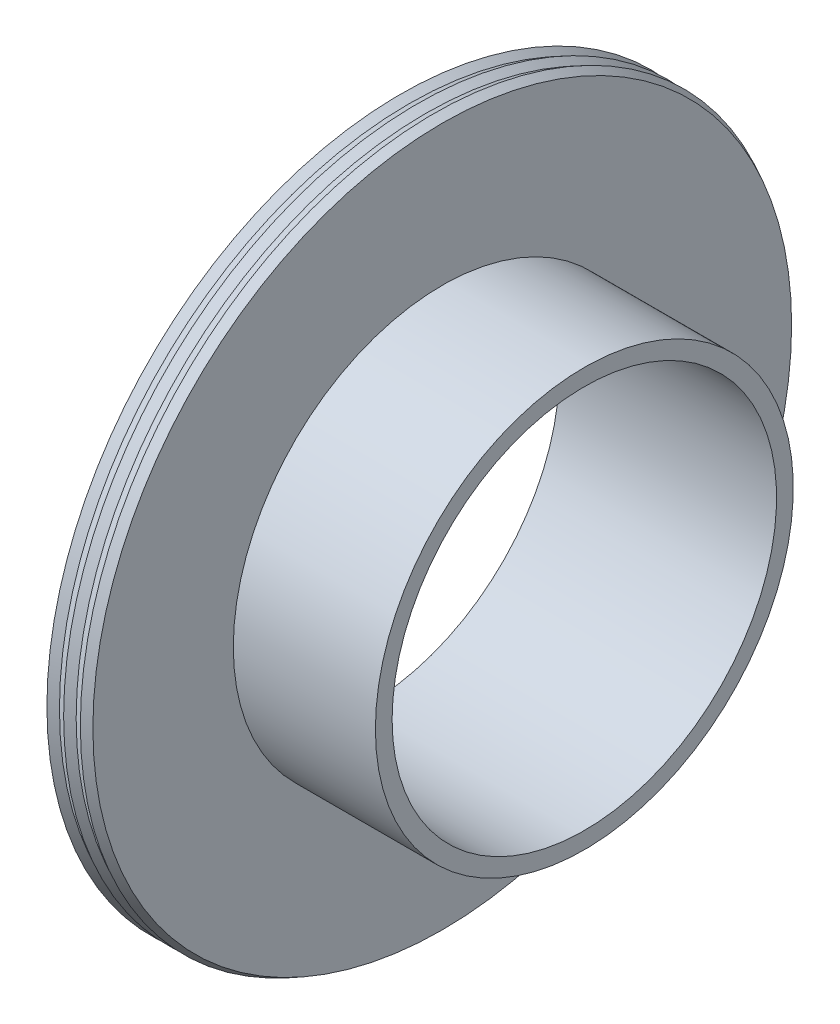
ISO-10303-21;
HEADER;
FILE_DESCRIPTION(('STEP AP214'),'2;1');
FILE_NAME('part.step','',(''),(''),'','','');
FILE_SCHEMA(('AUTOMOTIVE_DESIGN { 1 0 10303 214 1 1 1 1 }'));
ENDSEC;
DATA;
#1=APPLICATION_CONTEXT('core data for automotive mechanical design processes');
#2=APPLICATION_PROTOCOL_DEFINITION('international standard','automotive_design',2000,#1);
#3=PRODUCT_CONTEXT('',#1,'mechanical');
#4=PRODUCT('Part','Part','',(#3));
#5=PRODUCT_RELATED_PRODUCT_CATEGORY('part','',(#4));
#6=PRODUCT_DEFINITION_FORMATION('','',#4);
#7=PRODUCT_DEFINITION_CONTEXT('part definition',#1,'design');
#8=PRODUCT_DEFINITION('design','',#6,#7);
#9=PRODUCT_DEFINITION_SHAPE('','',#8);
#10=(LENGTH_UNIT() NAMED_UNIT(*) SI_UNIT(.MILLI.,.METRE.));
#11=(NAMED_UNIT(*) PLANE_ANGLE_UNIT() SI_UNIT($,.RADIAN.));
#12=(NAMED_UNIT(*) SI_UNIT($,.STERADIAN.) SOLID_ANGLE_UNIT());
#13=UNCERTAINTY_MEASURE_WITH_UNIT(LENGTH_MEASURE(1.E-05),#10,'distance_accuracy_value','');
#14=(GEOMETRIC_REPRESENTATION_CONTEXT(3) GLOBAL_UNCERTAINTY_ASSIGNED_CONTEXT((#13)) GLOBAL_UNIT_ASSIGNED_CONTEXT((#10,
#11,#12)) REPRESENTATION_CONTEXT('',''));
#15=CARTESIAN_POINT('',(0.,0.,0.));
#16=DIRECTION('',(0.,0.,1.));
#17=DIRECTION('',(1.,0.,0.));
#18=AXIS2_PLACEMENT_3D('',#15,#16,#17);
#19=CARTESIAN_POINT('',(6.00000000000001,0.,0.));
#20=DIRECTION('',(-1.,0.,0.));
#21=DIRECTION('',(0.,0.,1.));
#22=AXIS2_PLACEMENT_3D('',#19,#20,#21);
#23=CONICAL_SURFACE('',#22,42.3,0.463647609000817);
#24=CARTESIAN_POINT('',(7.,0.,0.));
#25=DIRECTION('',(-1.,0.,0.));
#26=DIRECTION('',(0.,0.,1.));
#27=AXIS2_PLACEMENT_3D('',#24,#25,#26);
#28=CIRCLE('',#27,41.8);
#29=CARTESIAN_POINT('',(7.,0.,41.8));
#30=VERTEX_POINT('',#29);
#31=EDGE_CURVE('E47',#30,#30,#28,.T.);
#32=ORIENTED_EDGE('',*,*,#31,.T.);
#33=EDGE_LOOP('',(#32));
#34=FACE_BOUND('',#33,.T.);
#35=CARTESIAN_POINT('',(6.00000000000001,0.,0.));
#36=DIRECTION('',(-1.,0.,0.));
#37=DIRECTION('',(0.,0.,1.));
#38=AXIS2_PLACEMENT_3D('',#35,#36,#37);
#39=CIRCLE('',#38,42.3);
#40=CARTESIAN_POINT('',(6.00000000000001,0.,42.3));
#41=VERTEX_POINT('',#40);
#42=EDGE_CURVE('E53',#41,#41,#39,.T.);
#43=ORIENTED_EDGE('',*,*,#42,.F.);
#44=EDGE_LOOP('',(#43));
#45=FACE_BOUND('',#44,.T.);
#46=ADVANCED_FACE('F41',(#34,#45),#23,.T.);
#47=CARTESIAN_POINT('',(7.,0.,0.));
#48=DIRECTION('',(1.,0.,0.));
#49=DIRECTION('',(0.,0.,-1.));
#50=AXIS2_PLACEMENT_3D('',#47,#48,#49);
#51=CONICAL_SURFACE('',#50,41.8,0.463647609000806);
#52=CARTESIAN_POINT('',(8.00000000000001,0.,0.));
#53=DIRECTION('',(-1.,0.,0.));
#54=DIRECTION('',(0.,0.,1.));
#55=AXIS2_PLACEMENT_3D('',#52,#53,#54);
#56=CIRCLE('',#55,42.3);
#57=CARTESIAN_POINT('',(8.00000000000001,0.,42.3));
#58=VERTEX_POINT('',#57);
#59=EDGE_CURVE('E10',#58,#58,#56,.T.);
#60=ORIENTED_EDGE('',*,*,#59,.T.);
#61=EDGE_LOOP('',(#60));
#62=FACE_BOUND('',#61,.T.);
#63=ORIENTED_EDGE('',*,*,#31,.F.);
#64=EDGE_LOOP('',(#63));
#65=FACE_BOUND('',#64,.T.);
#66=ADVANCED_FACE('F94',(#62,#65),#51,.T.);
#67=CARTESIAN_POINT('',(8.00000000000001,0.,0.));
#68=DIRECTION('',(-1.,0.,0.));
#69=DIRECTION('',(0.,0.,1.));
#70=AXIS2_PLACEMENT_3D('',#67,#68,#69);
#71=CONICAL_SURFACE('',#70,42.3,0.463647609000812);
#72=CARTESIAN_POINT('',(9.,0.,0.));
#73=DIRECTION('',(-1.,0.,0.));
#74=DIRECTION('',(0.,0.,1.));
#75=AXIS2_PLACEMENT_3D('',#72,#73,#74);
#76=CIRCLE('',#75,41.8);
#77=CARTESIAN_POINT('',(9.,0.,41.8));
#78=VERTEX_POINT('',#77);
#79=EDGE_CURVE('E66',#78,#78,#76,.T.);
#80=ORIENTED_EDGE('',*,*,#79,.T.);
#81=EDGE_LOOP('',(#80));
#82=FACE_BOUND('',#81,.T.);
#83=ORIENTED_EDGE('',*,*,#59,.F.);
#84=EDGE_LOOP('',(#83));
#85=FACE_BOUND('',#84,.T.);
#86=ADVANCED_FACE('F99',(#82,#85),#71,.T.);
#87=CARTESIAN_POINT('',(9.,0.,0.));
#88=DIRECTION('',(1.,0.,0.));
#89=DIRECTION('',(0.,0.,-1.));
#90=AXIS2_PLACEMENT_3D('',#87,#88,#89);
#91=PLANE('',#90);
#92=CARTESIAN_POINT('',(9.,0.,0.));
#93=DIRECTION('',(-1.,0.,0.));
#94=DIRECTION('',(0.,0.,1.));
#95=AXIS2_PLACEMENT_3D('',#92,#93,#94);
#96=CIRCLE('',#95,25.);
#97=CARTESIAN_POINT('',(9.,0.,25.));
#98=VERTEX_POINT('',#97);
#99=EDGE_CURVE('E75',#98,#98,#96,.T.);
#100=ORIENTED_EDGE('',*,*,#99,.T.);
#101=EDGE_LOOP('',(#100));
#102=FACE_BOUND('',#101,.T.);
#103=ORIENTED_EDGE('',*,*,#79,.F.);
#104=EDGE_LOOP('',(#103));
#105=FACE_BOUND('',#104,.T.);
#106=ADVANCED_FACE('F110',(#102,#105),#91,.T.);
#107=CARTESIAN_POINT('',(5.,0.,0.));
#108=DIRECTION('',(1.,0.,0.));
#109=DIRECTION('',(0.,0.,-1.));
#110=AXIS2_PLACEMENT_3D('',#107,#108,#109);
#111=CONICAL_SURFACE('',#110,41.8,0.463647609000806);
#112=ORIENTED_EDGE('',*,*,#42,.T.);
#113=EDGE_LOOP('',(#112));
#114=FACE_BOUND('',#113,.T.);
#115=CARTESIAN_POINT('',(5.,0.,0.));
#116=DIRECTION('',(-1.,0.,0.));
#117=DIRECTION('',(0.,0.,1.));
#118=AXIS2_PLACEMENT_3D('',#115,#116,#117);
#119=CIRCLE('',#118,41.8);
#120=CARTESIAN_POINT('',(5.,0.,41.8));
#121=VERTEX_POINT('',#120);
#122=EDGE_CURVE('E84',#121,#121,#119,.T.);
#123=ORIENTED_EDGE('',*,*,#122,.F.);
#124=EDGE_LOOP('',(#123));
#125=FACE_BOUND('',#124,.T.);
#126=ADVANCED_FACE('F89',(#114,#125),#111,.T.);
#127=CARTESIAN_POINT('',(4.,0.,0.));
#128=DIRECTION('',(-1.,0.,0.));
#129=DIRECTION('',(0.,0.,1.));
#130=AXIS2_PLACEMENT_3D('',#127,#128,#129);
#131=CONICAL_SURFACE('',#130,42.3,0.463647609000806);
#132=ORIENTED_EDGE('',*,*,#122,.T.);
#133=EDGE_LOOP('',(#132));
#134=FACE_BOUND('',#133,.T.);
#135=CARTESIAN_POINT('',(4.,0.,0.));
#136=DIRECTION('',(-1.,0.,0.));
#137=DIRECTION('',(0.,0.,1.));
#138=AXIS2_PLACEMENT_3D('',#135,#136,#137);
#139=CIRCLE('',#138,42.3);
#140=CARTESIAN_POINT('',(4.,0.,42.3));
#141=VERTEX_POINT('',#140);
#142=EDGE_CURVE('E85',#141,#141,#139,.T.);
#143=ORIENTED_EDGE('',*,*,#142,.F.);
#144=EDGE_LOOP('',(#143));
#145=FACE_BOUND('',#144,.T.);
#146=ADVANCED_FACE('F121',(#134,#145),#131,.T.);
#147=CARTESIAN_POINT('',(4.,0.,0.));
#148=DIRECTION('',(-1.,0.,0.));
#149=DIRECTION('',(0.,0.,1.));
#150=AXIS2_PLACEMENT_3D('',#147,#148,#149);
#151=PLANE('',#150);
#152=ORIENTED_EDGE('',*,*,#142,.T.);
#153=EDGE_LOOP('',(#152));
#154=FACE_BOUND('',#153,.T.);
#155=CARTESIAN_POINT('',(4.00000000000001,0.,0.));
#156=DIRECTION('',(-1.,0.,0.));
#157=DIRECTION('',(0.,0.,1.));
#158=AXIS2_PLACEMENT_3D('',#155,#156,#157);
#159=CIRCLE('',#158,25.);
#160=CARTESIAN_POINT('',(4.00000000000001,0.,25.));
#161=VERTEX_POINT('',#160);
#162=EDGE_CURVE('E79',#161,#161,#159,.T.);
#163=ORIENTED_EDGE('',*,*,#162,.F.);
#164=EDGE_LOOP('',(#163));
#165=FACE_BOUND('',#164,.T.);
#166=ADVANCED_FACE('F117',(#154,#165),#151,.T.);
#167=CARTESIAN_POINT('',(-59.6592581066923,0.,0.));
#168=DIRECTION('',(-1.,0.,0.));
#169=DIRECTION('',(0.,0.,1.));
#170=AXIS2_PLACEMENT_3D('',#167,#168,#169);
#171=CYLINDRICAL_SURFACE('',#170,23.);
#172=CARTESIAN_POINT('',(26.,0.,0.));
#173=DIRECTION('',(-1.,0.,0.));
#174=DIRECTION('',(0.,0.,1.));
#175=AXIS2_PLACEMENT_3D('',#172,#173,#174);
#176=CIRCLE('',#175,23.);
#177=CARTESIAN_POINT('',(26.,0.,23.));
#178=VERTEX_POINT('',#177);
#179=EDGE_CURVE('E62',#178,#178,#176,.T.);
#180=ORIENTED_EDGE('',*,*,#179,.F.);
#181=EDGE_LOOP('',(#180));
#182=FACE_BOUND('',#181,.T.);
#183=CARTESIAN_POINT('',(0.,0.,0.));
#184=DIRECTION('',(-1.,0.,0.));
#185=DIRECTION('',(0.,0.,1.));
#186=AXIS2_PLACEMENT_3D('',#183,#184,#185);
#187=CIRCLE('',#186,23.);
#188=CARTESIAN_POINT('',(0.,0.,23.));
#189=VERTEX_POINT('',#188);
#190=EDGE_CURVE('E44',#189,#189,#187,.T.);
#191=ORIENTED_EDGE('',*,*,#190,.T.);
#192=EDGE_LOOP('',(#191));
#193=FACE_BOUND('',#192,.T.);
#194=ADVANCED_FACE('F113',(#182,#193),#171,.F.);
#195=CARTESIAN_POINT('',(26.,23.,0.));
#196=DIRECTION('',(-1.,0.,0.));
#197=DIRECTION('',(0.,0.,1.));
#198=AXIS2_PLACEMENT_3D('',#195,#196,#197);
#199=PLANE('',#198);
#200=CARTESIAN_POINT('',(26.,0.,0.));
#201=DIRECTION('',(-1.,0.,0.));
#202=DIRECTION('',(0.,0.,1.));
#203=AXIS2_PLACEMENT_3D('',#200,#201,#202);
#204=CIRCLE('',#203,25.);
#205=CARTESIAN_POINT('',(26.,0.,25.));
#206=VERTEX_POINT('',#205);
#207=EDGE_CURVE('E63',#206,#206,#204,.T.);
#208=ORIENTED_EDGE('',*,*,#207,.F.);
#209=EDGE_LOOP('',(#208));
#210=FACE_BOUND('',#209,.T.);
#211=ORIENTED_EDGE('',*,*,#179,.T.);
#212=EDGE_LOOP('',(#211));
#213=FACE_BOUND('',#212,.T.);
#214=ADVANCED_FACE('F112',(#210,#213),#199,.F.);
#215=CARTESIAN_POINT('',(-59.6592581066923,0.,0.));
#216=DIRECTION('',(-1.,0.,0.));
#217=DIRECTION('',(0.,0.,1.));
#218=AXIS2_PLACEMENT_3D('',#215,#216,#217);
#219=CYLINDRICAL_SURFACE('',#218,25.);
#220=ORIENTED_EDGE('',*,*,#99,.F.);
#221=EDGE_LOOP('',(#220));
#222=FACE_BOUND('',#221,.T.);
#223=ORIENTED_EDGE('',*,*,#207,.T.);
#224=EDGE_LOOP('',(#223));
#225=FACE_BOUND('',#224,.T.);
#226=ADVANCED_FACE('F107',(#222,#225),#219,.T.);
#227=CARTESIAN_POINT('',(0.,25.,0.));
#228=DIRECTION('',(1.,0.,0.));
#229=DIRECTION('',(0.,0.,-1.));
#230=AXIS2_PLACEMENT_3D('',#227,#228,#229);
#231=PLANE('',#230);
#232=ORIENTED_EDGE('',*,*,#190,.F.);
#233=EDGE_LOOP('',(#232));
#234=FACE_BOUND('',#233,.T.);
#235=CARTESIAN_POINT('',(0.,0.,0.));
#236=DIRECTION('',(-1.,0.,0.));
#237=DIRECTION('',(0.,0.,1.));
#238=AXIS2_PLACEMENT_3D('',#235,#236,#237);
#239=CIRCLE('',#238,25.);
#240=CARTESIAN_POINT('',(0.,0.,25.));
#241=VERTEX_POINT('',#240);
#242=EDGE_CURVE('E59',#241,#241,#239,.T.);
#243=ORIENTED_EDGE('',*,*,#242,.T.);
#244=EDGE_LOOP('',(#243));
#245=FACE_BOUND('',#244,.T.);
#246=ADVANCED_FACE('F43',(#234,#245),#231,.F.);
#247=ORIENTED_EDGE('',*,*,#162,.T.);
#248=EDGE_LOOP('',(#247));
#249=FACE_BOUND('',#248,.T.);
#250=ORIENTED_EDGE('',*,*,#242,.F.);
#251=EDGE_LOOP('',(#250));
#252=FACE_BOUND('',#251,.T.);
#253=ADVANCED_FACE('F114',(#249,#252),#219,.T.);
#254=CLOSED_SHELL('',(#46,#66,#86,#106,#126,#146,#166,#194,#214,#226,#246,#253));
#255=MANIFOLD_SOLID_BREP('B2',#254);
#256=ADVANCED_BREP_SHAPE_REPRESENTATION('',(#18,#255),#14);
#257=SHAPE_DEFINITION_REPRESENTATION(#9,#256);
ENDSEC;
END-ISO-10303-21;
